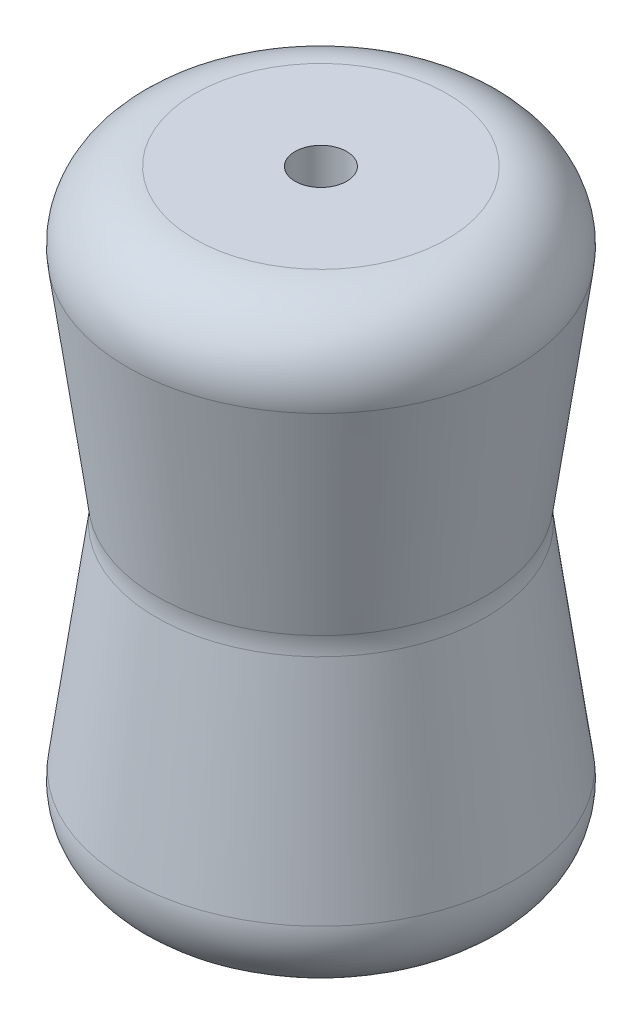
ISO-10303-21;
HEADER;
FILE_DESCRIPTION(('STEP AP214'),'2;1');
FILE_NAME('part.step','',(''),(''),'','','');
FILE_SCHEMA(('AUTOMOTIVE_DESIGN { 1 0 10303 214 1 1 1 1 }'));
ENDSEC;
DATA;
#1=APPLICATION_CONTEXT('core data for automotive mechanical design processes');
#2=APPLICATION_PROTOCOL_DEFINITION('international standard','automotive_design',2000,#1);
#3=PRODUCT_CONTEXT('',#1,'mechanical');
#4=PRODUCT('Part','Part','',(#3));
#5=PRODUCT_RELATED_PRODUCT_CATEGORY('part','',(#4));
#6=PRODUCT_DEFINITION_FORMATION('','',#4);
#7=PRODUCT_DEFINITION_CONTEXT('part definition',#1,'design');
#8=PRODUCT_DEFINITION('design','',#6,#7);
#9=PRODUCT_DEFINITION_SHAPE('','',#8);
#10=(LENGTH_UNIT() NAMED_UNIT(*) SI_UNIT(.MILLI.,.METRE.));
#11=(NAMED_UNIT(*) PLANE_ANGLE_UNIT() SI_UNIT($,.RADIAN.));
#12=(NAMED_UNIT(*) SI_UNIT($,.STERADIAN.) SOLID_ANGLE_UNIT());
#13=UNCERTAINTY_MEASURE_WITH_UNIT(LENGTH_MEASURE(1.E-05),#10,'distance_accuracy_value','');
#14=(GEOMETRIC_REPRESENTATION_CONTEXT(3) GLOBAL_UNCERTAINTY_ASSIGNED_CONTEXT((#13)) GLOBAL_UNIT_ASSIGNED_CONTEXT((#10,
#11,#12)) REPRESENTATION_CONTEXT('',''));
#15=CARTESIAN_POINT('',(0.,0.,0.));
#16=DIRECTION('',(0.,0.,1.));
#17=DIRECTION('',(1.,0.,0.));
#18=AXIS2_PLACEMENT_3D('',#15,#16,#17);
#19=CARTESIAN_POINT('',(0.,22.,0.));
#20=DIRECTION('',(0.,-1.,0.));
#21=DIRECTION('',(1.,0.,0.));
#22=AXIS2_PLACEMENT_3D('',#19,#20,#21);
#23=CONICAL_SURFACE('',#22,12.,0.135527713985501);
#24=CARTESIAN_POINT('',(0.,21.3244339763334,0.));
#25=DIRECTION('',(0.,1.,0.));
#26=DIRECTION('',(-1.,0.,0.));
#27=AXIS2_PLACEMENT_3D('',#24,#25,#26);
#28=CIRCLE('',#27,12.0921226395909);
#29=CARTESIAN_POINT('',(-12.0921226395909,21.3244339763334,0.));
#30=VERTEX_POINT('',#29);
#31=EDGE_CURVE('E48',#30,#30,#28,.F.);
#32=ORIENTED_EDGE('',*,*,#31,.T.);
#33=EDGE_LOOP('',(#32));
#34=FACE_BOUND('',#33,.T.);
#35=CARTESIAN_POINT('',(0.,5.67556602366658,0.));
#36=DIRECTION('',(0.,1.,0.));
#37=DIRECTION('',(-1.,0.,0.));
#38=AXIS2_PLACEMENT_3D('',#35,#36,#37);
#39=CIRCLE('',#38,14.2260591785909);
#40=CARTESIAN_POINT('',(-14.2260591785909,5.67556602366657,0.));
#41=VERTEX_POINT('',#40);
#42=EDGE_CURVE('E52',#41,#41,#39,.T.);
#43=ORIENTED_EDGE('',*,*,#42,.T.);
#44=EDGE_LOOP('',(#43));
#45=FACE_BOUND('',#44,.T.);
#46=ADVANCED_FACE('F41',(#34,#45),#23,.T.);
#47=CARTESIAN_POINT('',(0.,0.,0.));
#48=DIRECTION('',(0.,1.,0.));
#49=DIRECTION('',(-1.,0.,0.));
#50=AXIS2_PLACEMENT_3D('',#47,#48,#49);
#51=PLANE('',#50);
#52=CARTESIAN_POINT('',(0.,0.,0.));
#53=DIRECTION('',(0.,1.,0.));
#54=DIRECTION('',(-1.,0.,0.));
#55=AXIS2_PLACEMENT_3D('',#52,#53,#54);
#56=CIRCLE('',#55,9.27190833836942);
#57=CARTESIAN_POINT('',(-9.27190833836942,0.,0.));
#58=VERTEX_POINT('',#57);
#59=EDGE_CURVE('E10',#58,#58,#56,.F.);
#60=ORIENTED_EDGE('',*,*,#59,.T.);
#61=EDGE_LOOP('',(#60));
#62=FACE_BOUND('',#61,.T.);
#63=CARTESIAN_POINT('',(0.,0.,0.));
#64=DIRECTION('',(0.,-1.,0.));
#65=DIRECTION('',(0.,0.,-1.));
#66=AXIS2_PLACEMENT_3D('',#63,#64,#65);
#67=CIRCLE('',#66,1.9);
#68=CARTESIAN_POINT('',(0.,0.,-1.9));
#69=VERTEX_POINT('',#68);
#70=EDGE_CURVE('E70',#69,#69,#67,.T.);
#71=ORIENTED_EDGE('',*,*,#70,.F.);
#72=EDGE_LOOP('',(#71));
#73=FACE_BOUND('',#72,.T.);
#74=ADVANCED_FACE('F76',(#62,#73),#51,.F.);
#75=CARTESIAN_POINT('',(-15.,44.,0.));
#76=DIRECTION('',(0.,1.,0.));
#77=DIRECTION('',(-1.,0.,0.));
#78=AXIS2_PLACEMENT_3D('',#75,#76,#77);
#79=PLANE('',#78);
#80=CARTESIAN_POINT('',(0.,44.,0.));
#81=DIRECTION('',(0.,1.,0.));
#82=DIRECTION('',(-1.,0.,0.));
#83=AXIS2_PLACEMENT_3D('',#80,#81,#82);
#84=CIRCLE('',#83,9.27190833836943);
#85=CARTESIAN_POINT('',(-9.27190833836943,44.,0.));
#86=VERTEX_POINT('',#85);
#87=EDGE_CURVE('E56',#86,#86,#84,.T.);
#88=ORIENTED_EDGE('',*,*,#87,.T.);
#89=EDGE_LOOP('',(#88));
#90=FACE_BOUND('',#89,.T.);
#91=CARTESIAN_POINT('',(0.,44.,0.));
#92=DIRECTION('',(0.,1.,0.));
#93=DIRECTION('',(-1.,0.,0.));
#94=AXIS2_PLACEMENT_3D('',#91,#92,#93);
#95=CIRCLE('',#94,1.9);
#96=CARTESIAN_POINT('',(-1.9,44.,0.));
#97=VERTEX_POINT('',#96);
#98=EDGE_CURVE('E67',#97,#97,#95,.T.);
#99=ORIENTED_EDGE('',*,*,#98,.F.);
#100=EDGE_LOOP('',(#99));
#101=FACE_BOUND('',#100,.T.);
#102=ADVANCED_FACE('F78',(#90,#101),#79,.T.);
#103=CARTESIAN_POINT('',(0.,22.,0.));
#104=DIRECTION('',(0.,1.,0.));
#105=DIRECTION('',(-1.,0.,0.));
#106=AXIS2_PLACEMENT_3D('',#103,#104,#105);
#107=CONICAL_SURFACE('',#106,12.,0.135527713985501);
#108=CARTESIAN_POINT('',(0.,38.3244339763334,0.));
#109=DIRECTION('',(0.,-1.,0.));
#110=DIRECTION('',(1.,0.,0.));
#111=AXIS2_PLACEMENT_3D('',#108,#109,#110);
#112=CIRCLE('',#111,14.2260591785909);
#113=CARTESIAN_POINT('',(14.2260591785909,38.3244339763334,0.));
#114=VERTEX_POINT('',#113);
#115=EDGE_CURVE('E61',#114,#114,#112,.T.);
#116=ORIENTED_EDGE('',*,*,#115,.T.);
#117=EDGE_LOOP('',(#116));
#118=FACE_BOUND('',#117,.T.);
#119=CARTESIAN_POINT('',(0.,22.6755660236666,0.));
#120=DIRECTION('',(0.,-1.,0.));
#121=DIRECTION('',(1.,0.,0.));
#122=AXIS2_PLACEMENT_3D('',#119,#120,#121);
#123=CIRCLE('',#122,12.0921226395909);
#124=CARTESIAN_POINT('',(12.0921226395909,22.6755660236666,0.));
#125=VERTEX_POINT('',#124);
#126=EDGE_CURVE('E64',#125,#125,#123,.F.);
#127=ORIENTED_EDGE('',*,*,#126,.T.);
#128=EDGE_LOOP('',(#127));
#129=FACE_BOUND('',#128,.T.);
#130=ADVANCED_FACE('F84',(#118,#129),#107,.T.);
#131=CARTESIAN_POINT('',(0.,60.,0.));
#132=DIRECTION('',(0.,-1.,0.));
#133=DIRECTION('',(0.,0.,-1.));
#134=AXIS2_PLACEMENT_3D('',#131,#132,#133);
#135=CYLINDRICAL_SURFACE('',#134,1.9);
#136=ORIENTED_EDGE('',*,*,#98,.T.);
#137=EDGE_LOOP('',(#136));
#138=FACE_BOUND('',#137,.T.);
#139=ORIENTED_EDGE('',*,*,#70,.T.);
#140=EDGE_LOOP('',(#139));
#141=FACE_BOUND('',#140,.T.);
#142=ADVANCED_FACE('F74',(#138,#141),#135,.F.);
#143=CARTESIAN_POINT('',(0.,39.,0.));
#144=DIRECTION('',(0.,1.,0.));
#145=DIRECTION('',(-1.,0.,0.));
#146=AXIS2_PLACEMENT_3D('',#143,#144,#145);
#147=TOROIDAL_SURFACE('',#146,9.27190833836943,5.);
#148=ORIENTED_EDGE('',*,*,#87,.F.);
#149=EDGE_LOOP('',(#148));
#150=FACE_BOUND('',#149,.T.);
#151=ORIENTED_EDGE('',*,*,#115,.F.);
#152=EDGE_LOOP('',(#151));
#153=FACE_BOUND('',#152,.T.);
#154=ADVANCED_FACE('F93',(#150,#153),#147,.T.);
#155=CARTESIAN_POINT('',(0.,22.,0.));
#156=DIRECTION('',(0.,-1.,0.));
#157=DIRECTION('',(1.,0.,0.));
#158=AXIS2_PLACEMENT_3D('',#155,#156,#157);
#159=TOROIDAL_SURFACE('',#158,17.0462734798124,5.);
#160=ORIENTED_EDGE('',*,*,#126,.F.);
#161=EDGE_LOOP('',(#160));
#162=FACE_BOUND('',#161,.T.);
#163=ORIENTED_EDGE('',*,*,#31,.F.);
#164=EDGE_LOOP('',(#163));
#165=FACE_BOUND('',#164,.T.);
#166=ADVANCED_FACE('F95',(#162,#165),#159,.F.);
#167=CARTESIAN_POINT('',(0.,5.,0.));
#168=DIRECTION('',(0.,1.,0.));
#169=DIRECTION('',(-1.,0.,0.));
#170=AXIS2_PLACEMENT_3D('',#167,#168,#169);
#171=TOROIDAL_SURFACE('',#170,9.27190833836942,5.);
#172=ORIENTED_EDGE('',*,*,#42,.F.);
#173=EDGE_LOOP('',(#172));
#174=FACE_BOUND('',#173,.T.);
#175=ORIENTED_EDGE('',*,*,#59,.F.);
#176=EDGE_LOOP('',(#175));
#177=FACE_BOUND('',#176,.T.);
#178=ADVANCED_FACE('F43',(#174,#177),#171,.T.);
#179=CLOSED_SHELL('',(#46,#74,#102,#130,#142,#154,#166,#178));
#180=MANIFOLD_SOLID_BREP('B2',#179);
#181=ADVANCED_BREP_SHAPE_REPRESENTATION('',(#18,#180),#14);
#182=SHAPE_DEFINITION_REPRESENTATION(#9,#181);
ENDSEC;
END-ISO-10303-21;
